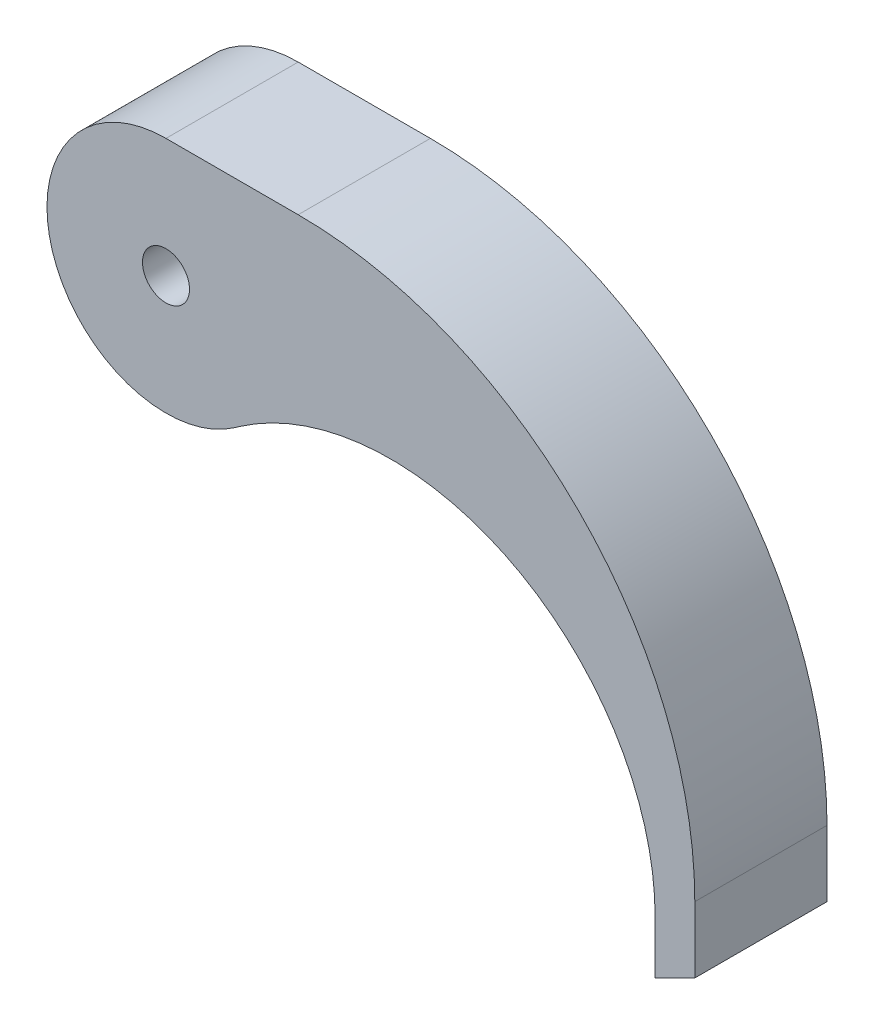
ISO-10303-21;
HEADER;
FILE_DESCRIPTION(('STEP AP214'),'2;1');
FILE_NAME('part.step','',(''),(''),'','','');
FILE_SCHEMA(('AUTOMOTIVE_DESIGN { 1 0 10303 214 1 1 1 1 }'));
ENDSEC;
DATA;
#1=APPLICATION_CONTEXT('core data for automotive mechanical design processes');
#2=APPLICATION_PROTOCOL_DEFINITION('international standard','automotive_design',2000,#1);
#3=PRODUCT_CONTEXT('',#1,'mechanical');
#4=PRODUCT('Part','Part','',(#3));
#5=PRODUCT_RELATED_PRODUCT_CATEGORY('part','',(#4));
#6=PRODUCT_DEFINITION_FORMATION('','',#4);
#7=PRODUCT_DEFINITION_CONTEXT('part definition',#1,'design');
#8=PRODUCT_DEFINITION('design','',#6,#7);
#9=PRODUCT_DEFINITION_SHAPE('','',#8);
#10=(LENGTH_UNIT() NAMED_UNIT(*) SI_UNIT(.MILLI.,.METRE.));
#11=(NAMED_UNIT(*) PLANE_ANGLE_UNIT() SI_UNIT($,.RADIAN.));
#12=(NAMED_UNIT(*) SI_UNIT($,.STERADIAN.) SOLID_ANGLE_UNIT());
#13=UNCERTAINTY_MEASURE_WITH_UNIT(LENGTH_MEASURE(1.E-05),#10,'distance_accuracy_value','');
#14=(GEOMETRIC_REPRESENTATION_CONTEXT(3) GLOBAL_UNCERTAINTY_ASSIGNED_CONTEXT((#13)) GLOBAL_UNIT_ASSIGNED_CONTEXT((#10,
#11,#12)) REPRESENTATION_CONTEXT('',''));
#15=CARTESIAN_POINT('',(0.,0.,0.));
#16=DIRECTION('',(0.,0.,1.));
#17=DIRECTION('',(1.,0.,0.));
#18=AXIS2_PLACEMENT_3D('',#15,#16,#17);
#19=CARTESIAN_POINT('',(0.,0.,10.));
#20=DIRECTION('',(0.,0.,1.));
#21=DIRECTION('',(1.,0.,0.));
#22=AXIS2_PLACEMENT_3D('',#19,#20,#21);
#23=PLANE('',#22);
#24=CARTESIAN_POINT('',(0.,0.,10.));
#25=DIRECTION('',(0.,0.,1.));
#26=DIRECTION('',(1.,0.,0.));
#27=AXIS2_PLACEMENT_3D('',#24,#25,#26);
#28=CIRCLE('',#27,9.);
#29=CARTESIAN_POINT('',(0.,9.,10.));
#30=VERTEX_POINT('',#29);
#31=CARTESIAN_POINT('',(5.14858841010407,-7.38187221396727,10.));
#32=VERTEX_POINT('',#31);
#33=EDGE_CURVE('E145',#30,#32,#28,.T.);
#34=ORIENTED_EDGE('',*,*,#33,.T.);
#35=DIRECTION('',(0.820208023774142,0.572065378900451,0.));
#36=VECTOR('',#35,1.);
#37=CARTESIAN_POINT('',(5.14858841010407,-7.38187221396727,10.));
#38=LINE('',#37,#36);
#39=CARTESIAN_POINT('',(5.55869242199095,-7.09583952451718,10.));
#40=VERTEX_POINT('',#39);
#41=EDGE_CURVE('E93',#32,#40,#38,.T.);
#42=ORIENTED_EDGE('',*,*,#41,.T.);
#43=CARTESIAN_POINT('',(17.,-23.5,10.));
#44=DIRECTION('',(0.,0.,-1.));
#45=DIRECTION('',(-1.,0.,0.));
#46=AXIS2_PLACEMENT_3D('',#43,#44,#45);
#47=CIRCLE('',#46,20.);
#48=CARTESIAN_POINT('',(37.,-23.5,10.));
#49=VERTEX_POINT('',#48);
#50=EDGE_CURVE('E160',#40,#49,#47,.T.);
#51=ORIENTED_EDGE('',*,*,#50,.T.);
#52=DIRECTION('',(0.,-1.,0.));
#53=VECTOR('',#52,1.);
#54=CARTESIAN_POINT('',(37.,-27.5,10.));
#55=LINE('',#54,#53);
#56=CARTESIAN_POINT('',(37.,-27.5,10.));
#57=VERTEX_POINT('',#56);
#58=EDGE_CURVE('E173',#49,#57,#55,.T.);
#59=ORIENTED_EDGE('',*,*,#58,.T.);
#60=DIRECTION('',(0.894427190999915,0.44721359549996,0.));
#61=VECTOR('',#60,1.);
#62=CARTESIAN_POINT('',(40.,-26.,10.));
#63=LINE('',#62,#61);
#64=CARTESIAN_POINT('',(40.,-26.,10.));
#65=VERTEX_POINT('',#64);
#66=EDGE_CURVE('E112',#57,#65,#63,.T.);
#67=ORIENTED_EDGE('',*,*,#66,.T.);
#68=DIRECTION('',(0.,1.,0.));
#69=VECTOR('',#68,1.);
#70=CARTESIAN_POINT('',(40.,-21.,10.));
#71=LINE('',#70,#69);
#72=CARTESIAN_POINT('',(40.,-21.,10.));
#73=VERTEX_POINT('',#72);
#74=EDGE_CURVE('E106',#65,#73,#71,.T.);
#75=ORIENTED_EDGE('',*,*,#74,.T.);
#76=CARTESIAN_POINT('',(10.,-21.,10.));
#77=DIRECTION('',(0.,0.,1.));
#78=DIRECTION('',(-1.,0.,0.));
#79=AXIS2_PLACEMENT_3D('',#76,#77,#78);
#80=CIRCLE('',#79,30.);
#81=CARTESIAN_POINT('',(10.,9.,10.));
#82=VERTEX_POINT('',#81);
#83=EDGE_CURVE('E110',#73,#82,#80,.T.);
#84=ORIENTED_EDGE('',*,*,#83,.T.);
#85=DIRECTION('',(-1.,0.,0.));
#86=VECTOR('',#85,1.);
#87=CARTESIAN_POINT('',(0.,9.,10.));
#88=LINE('',#87,#86);
#89=EDGE_CURVE('E50',#82,#30,#88,.T.);
#90=ORIENTED_EDGE('',*,*,#89,.T.);
#91=EDGE_LOOP('',(#34,#42,#51,#59,#67,#75,#84,#90));
#92=FACE_BOUND('',#91,.T.);
#93=CARTESIAN_POINT('',(0.,0.,10.));
#94=DIRECTION('',(0.,0.,1.));
#95=DIRECTION('',(1.,0.,0.));
#96=AXIS2_PLACEMENT_3D('',#93,#94,#95);
#97=CIRCLE('',#96,1.778);
#98=CARTESIAN_POINT('',(1.778,0.,10.));
#99=VERTEX_POINT('',#98);
#100=EDGE_CURVE('E134',#99,#99,#97,.T.);
#101=ORIENTED_EDGE('',*,*,#100,.F.);
#102=EDGE_LOOP('',(#101));
#103=FACE_BOUND('',#102,.T.);
#104=ADVANCED_FACE('F33',(#92,#103),#23,.T.);
#105=CARTESIAN_POINT('',(0.,0.,0.));
#106=DIRECTION('',(0.,0.,1.));
#107=DIRECTION('',(1.,0.,0.));
#108=AXIS2_PLACEMENT_3D('',#105,#106,#107);
#109=PLANE('',#108);
#110=CARTESIAN_POINT('',(0.,0.,0.));
#111=DIRECTION('',(0.,0.,1.));
#112=DIRECTION('',(1.,0.,0.));
#113=AXIS2_PLACEMENT_3D('',#110,#111,#112);
#114=CIRCLE('',#113,9.);
#115=CARTESIAN_POINT('',(0.,9.,0.));
#116=VERTEX_POINT('',#115);
#117=CARTESIAN_POINT('',(5.14858841010407,-7.38187221396727,0.));
#118=VERTEX_POINT('',#117);
#119=EDGE_CURVE('E130',#116,#118,#114,.T.);
#120=ORIENTED_EDGE('',*,*,#119,.F.);
#121=DIRECTION('',(-1.,0.,0.));
#122=VECTOR('',#121,1.);
#123=CARTESIAN_POINT('',(0.,9.,0.));
#124=LINE('',#123,#122);
#125=CARTESIAN_POINT('',(10.,9.,0.));
#126=VERTEX_POINT('',#125);
#127=EDGE_CURVE('E85',#126,#116,#124,.T.);
#128=ORIENTED_EDGE('',*,*,#127,.F.);
#129=CARTESIAN_POINT('',(10.,-21.,0.));
#130=DIRECTION('',(0.,0.,1.));
#131=DIRECTION('',(-1.,0.,0.));
#132=AXIS2_PLACEMENT_3D('',#129,#130,#131);
#133=CIRCLE('',#132,30.);
#134=CARTESIAN_POINT('',(40.,-21.,0.));
#135=VERTEX_POINT('',#134);
#136=EDGE_CURVE('E79',#135,#126,#133,.T.);
#137=ORIENTED_EDGE('',*,*,#136,.F.);
#138=DIRECTION('',(0.,1.,0.));
#139=VECTOR('',#138,1.);
#140=CARTESIAN_POINT('',(40.,-21.,0.));
#141=LINE('',#140,#139);
#142=CARTESIAN_POINT('',(40.,-26.,0.));
#143=VERTEX_POINT('',#142);
#144=EDGE_CURVE('E120',#143,#135,#141,.T.);
#145=ORIENTED_EDGE('',*,*,#144,.F.);
#146=DIRECTION('',(0.894427190999915,0.44721359549996,0.));
#147=VECTOR('',#146,1.);
#148=CARTESIAN_POINT('',(40.,-26.,0.));
#149=LINE('',#148,#147);
#150=CARTESIAN_POINT('',(37.,-27.5,0.));
#151=VERTEX_POINT('',#150);
#152=EDGE_CURVE('E140',#151,#143,#149,.T.);
#153=ORIENTED_EDGE('',*,*,#152,.F.);
#154=DIRECTION('',(0.,-1.,0.));
#155=VECTOR('',#154,1.);
#156=CARTESIAN_POINT('',(37.,-27.5,0.));
#157=LINE('',#156,#155);
#158=CARTESIAN_POINT('',(37.,-23.5,0.));
#159=VERTEX_POINT('',#158);
#160=EDGE_CURVE('E138',#159,#151,#157,.T.);
#161=ORIENTED_EDGE('',*,*,#160,.F.);
#162=CARTESIAN_POINT('',(17.,-23.5,0.));
#163=DIRECTION('',(0.,0.,-1.));
#164=DIRECTION('',(-1.,0.,0.));
#165=AXIS2_PLACEMENT_3D('',#162,#163,#164);
#166=CIRCLE('',#165,20.);
#167=CARTESIAN_POINT('',(5.55869242199095,-7.09583952451718,0.));
#168=VERTEX_POINT('',#167);
#169=EDGE_CURVE('E136',#168,#159,#166,.T.);
#170=ORIENTED_EDGE('',*,*,#169,.F.);
#171=DIRECTION('',(0.820208023774142,0.572065378900451,0.));
#172=VECTOR('',#171,1.);
#173=CARTESIAN_POINT('',(5.14858841010407,-7.38187221396727,0.));
#174=LINE('',#173,#172);
#175=EDGE_CURVE('E133',#118,#168,#174,.T.);
#176=ORIENTED_EDGE('',*,*,#175,.F.);
#177=EDGE_LOOP('',(#120,#128,#137,#145,#153,#161,#170,#176));
#178=FACE_BOUND('',#177,.T.);
#179=CARTESIAN_POINT('',(0.,0.,0.));
#180=DIRECTION('',(0.,0.,1.));
#181=DIRECTION('',(1.,0.,0.));
#182=AXIS2_PLACEMENT_3D('',#179,#180,#181);
#183=CIRCLE('',#182,1.778);
#184=CARTESIAN_POINT('',(1.778,0.,0.));
#185=VERTEX_POINT('',#184);
#186=EDGE_CURVE('E179',#185,#185,#183,.T.);
#187=ORIENTED_EDGE('',*,*,#186,.T.);
#188=EDGE_LOOP('',(#187));
#189=FACE_BOUND('',#188,.T.);
#190=ADVANCED_FACE('F164',(#178,#189),#109,.F.);
#191=CARTESIAN_POINT('',(0.,0.,10.));
#192=DIRECTION('',(0.,0.,-1.));
#193=DIRECTION('',(-1.,0.,0.));
#194=AXIS2_PLACEMENT_3D('',#191,#192,#193);
#195=CYLINDRICAL_SURFACE('',#194,9.);
#196=ORIENTED_EDGE('',*,*,#119,.T.);
#197=DIRECTION('',(0.,0.,-1.));
#198=VECTOR('',#197,1.);
#199=CARTESIAN_POINT('',(5.14858841010407,-7.38187221396727,10.));
#200=LINE('',#199,#198);
#201=EDGE_CURVE('E11',#32,#118,#200,.T.);
#202=ORIENTED_EDGE('',*,*,#201,.F.);
#203=ORIENTED_EDGE('',*,*,#33,.F.);
#204=DIRECTION('',(0.,0.,-1.));
#205=VECTOR('',#204,1.);
#206=CARTESIAN_POINT('',(0.,9.,10.));
#207=LINE('',#206,#205);
#208=EDGE_CURVE('E126',#30,#116,#207,.T.);
#209=ORIENTED_EDGE('',*,*,#208,.T.);
#210=EDGE_LOOP('',(#196,#202,#203,#209));
#211=FACE_BOUND('',#210,.T.);
#212=ADVANCED_FACE('F35',(#211),#195,.T.);
#213=CARTESIAN_POINT('',(5.14858841010407,-7.38187221396727,10.));
#214=DIRECTION('',(-0.572065378900451,0.820208023774142,0.));
#215=DIRECTION('',(-0.820208023774142,-0.572065378900451,0.));
#216=AXIS2_PLACEMENT_3D('',#213,#214,#215);
#217=PLANE('',#216);
#218=ORIENTED_EDGE('',*,*,#175,.T.);
#219=DIRECTION('',(0.,0.,-1.));
#220=VECTOR('',#219,1.);
#221=CARTESIAN_POINT('',(5.55869242199095,-7.09583952451718,10.));
#222=LINE('',#221,#220);
#223=EDGE_CURVE('E42',#40,#168,#222,.T.);
#224=ORIENTED_EDGE('',*,*,#223,.F.);
#225=ORIENTED_EDGE('',*,*,#41,.F.);
#226=ORIENTED_EDGE('',*,*,#201,.T.);
#227=EDGE_LOOP('',(#218,#224,#225,#226));
#228=FACE_BOUND('',#227,.T.);
#229=ADVANCED_FACE('F207',(#228),#217,.F.);
#230=CARTESIAN_POINT('',(17.,-23.5,10.));
#231=DIRECTION('',(0.,0.,-1.));
#232=DIRECTION('',(-1.,0.,0.));
#233=AXIS2_PLACEMENT_3D('',#230,#231,#232);
#234=CYLINDRICAL_SURFACE('',#233,20.);
#235=ORIENTED_EDGE('',*,*,#169,.T.);
#236=DIRECTION('',(0.,0.,-1.));
#237=VECTOR('',#236,1.);
#238=CARTESIAN_POINT('',(37.,-23.5,10.));
#239=LINE('',#238,#237);
#240=EDGE_CURVE('E152',#49,#159,#239,.T.);
#241=ORIENTED_EDGE('',*,*,#240,.F.);
#242=ORIENTED_EDGE('',*,*,#50,.F.);
#243=ORIENTED_EDGE('',*,*,#223,.T.);
#244=EDGE_LOOP('',(#235,#241,#242,#243));
#245=FACE_BOUND('',#244,.T.);
#246=ADVANCED_FACE('F158',(#245),#234,.F.);
#247=CARTESIAN_POINT('',(37.,-27.5,10.));
#248=DIRECTION('',(1.,0.,0.));
#249=DIRECTION('',(0.,1.,0.));
#250=AXIS2_PLACEMENT_3D('',#247,#248,#249);
#251=PLANE('',#250);
#252=ORIENTED_EDGE('',*,*,#160,.T.);
#253=DIRECTION('',(0.,0.,-1.));
#254=VECTOR('',#253,1.);
#255=CARTESIAN_POINT('',(37.,-27.5,10.));
#256=LINE('',#255,#254);
#257=EDGE_CURVE('E149',#57,#151,#256,.T.);
#258=ORIENTED_EDGE('',*,*,#257,.F.);
#259=ORIENTED_EDGE('',*,*,#58,.F.);
#260=ORIENTED_EDGE('',*,*,#240,.T.);
#261=EDGE_LOOP('',(#252,#258,#259,#260));
#262=FACE_BOUND('',#261,.T.);
#263=ADVANCED_FACE('F169',(#262),#251,.F.);
#264=CARTESIAN_POINT('',(40.,-26.,10.));
#265=DIRECTION('',(-0.44721359549996,0.894427190999915,0.));
#266=DIRECTION('',(-0.894427190999915,-0.44721359549996,0.));
#267=AXIS2_PLACEMENT_3D('',#264,#265,#266);
#268=PLANE('',#267);
#269=ORIENTED_EDGE('',*,*,#152,.T.);
#270=DIRECTION('',(0.,0.,-1.));
#271=VECTOR('',#270,1.);
#272=CARTESIAN_POINT('',(40.,-26.,10.));
#273=LINE('',#272,#271);
#274=EDGE_CURVE('E121',#65,#143,#273,.T.);
#275=ORIENTED_EDGE('',*,*,#274,.F.);
#276=ORIENTED_EDGE('',*,*,#66,.F.);
#277=ORIENTED_EDGE('',*,*,#257,.T.);
#278=EDGE_LOOP('',(#269,#275,#276,#277));
#279=FACE_BOUND('',#278,.T.);
#280=ADVANCED_FACE('F172',(#279),#268,.F.);
#281=CARTESIAN_POINT('',(40.,-21.,10.));
#282=DIRECTION('',(-1.,0.,0.));
#283=DIRECTION('',(0.,0.,1.));
#284=AXIS2_PLACEMENT_3D('',#281,#282,#283);
#285=PLANE('',#284);
#286=ORIENTED_EDGE('',*,*,#144,.T.);
#287=DIRECTION('',(0.,0.,-1.));
#288=VECTOR('',#287,1.);
#289=CARTESIAN_POINT('',(40.,-21.,10.));
#290=LINE('',#289,#288);
#291=EDGE_CURVE('E117',#73,#135,#290,.T.);
#292=ORIENTED_EDGE('',*,*,#291,.F.);
#293=ORIENTED_EDGE('',*,*,#74,.F.);
#294=ORIENTED_EDGE('',*,*,#274,.T.);
#295=EDGE_LOOP('',(#286,#292,#293,#294));
#296=FACE_BOUND('',#295,.T.);
#297=ADVANCED_FACE('F118',(#296),#285,.F.);
#298=CARTESIAN_POINT('',(10.,-21.,10.));
#299=DIRECTION('',(0.,0.,-1.));
#300=DIRECTION('',(-1.,0.,0.));
#301=AXIS2_PLACEMENT_3D('',#298,#299,#300);
#302=CYLINDRICAL_SURFACE('',#301,30.);
#303=ORIENTED_EDGE('',*,*,#136,.T.);
#304=DIRECTION('',(0.,0.,-1.));
#305=VECTOR('',#304,1.);
#306=CARTESIAN_POINT('',(10.,9.,10.));
#307=LINE('',#306,#305);
#308=EDGE_CURVE('E122',#82,#126,#307,.T.);
#309=ORIENTED_EDGE('',*,*,#308,.F.);
#310=ORIENTED_EDGE('',*,*,#83,.F.);
#311=ORIENTED_EDGE('',*,*,#291,.T.);
#312=EDGE_LOOP('',(#303,#309,#310,#311));
#313=FACE_BOUND('',#312,.T.);
#314=ADVANCED_FACE('F124',(#313),#302,.T.);
#315=CARTESIAN_POINT('',(0.,9.,10.));
#316=DIRECTION('',(0.,-1.,0.));
#317=DIRECTION('',(0.,0.,-1.));
#318=AXIS2_PLACEMENT_3D('',#315,#316,#317);
#319=PLANE('',#318);
#320=ORIENTED_EDGE('',*,*,#127,.T.);
#321=ORIENTED_EDGE('',*,*,#208,.F.);
#322=ORIENTED_EDGE('',*,*,#89,.F.);
#323=ORIENTED_EDGE('',*,*,#308,.T.);
#324=EDGE_LOOP('',(#320,#321,#322,#323));
#325=FACE_BOUND('',#324,.T.);
#326=ADVANCED_FACE('F195',(#325),#319,.F.);
#327=CARTESIAN_POINT('',(0.,0.,10.));
#328=DIRECTION('',(0.,0.,-1.));
#329=DIRECTION('',(-1.,0.,0.));
#330=AXIS2_PLACEMENT_3D('',#327,#328,#329);
#331=CYLINDRICAL_SURFACE('',#330,1.778);
#332=ORIENTED_EDGE('',*,*,#100,.T.);
#333=EDGE_LOOP('',(#332));
#334=FACE_BOUND('',#333,.T.);
#335=ORIENTED_EDGE('',*,*,#186,.F.);
#336=EDGE_LOOP('',(#335));
#337=FACE_BOUND('',#336,.T.);
#338=ADVANCED_FACE('F185',(#334,#337),#331,.F.);
#339=CLOSED_SHELL('',(#104,#190,#212,#229,#246,#263,#280,#297,#314,#326,#338));
#340=MANIFOLD_SOLID_BREP('B2',#339);
#341=ADVANCED_BREP_SHAPE_REPRESENTATION('',(#18,#340),#14);
#342=SHAPE_DEFINITION_REPRESENTATION(#9,#341);
ENDSEC;
END-ISO-10303-21;
